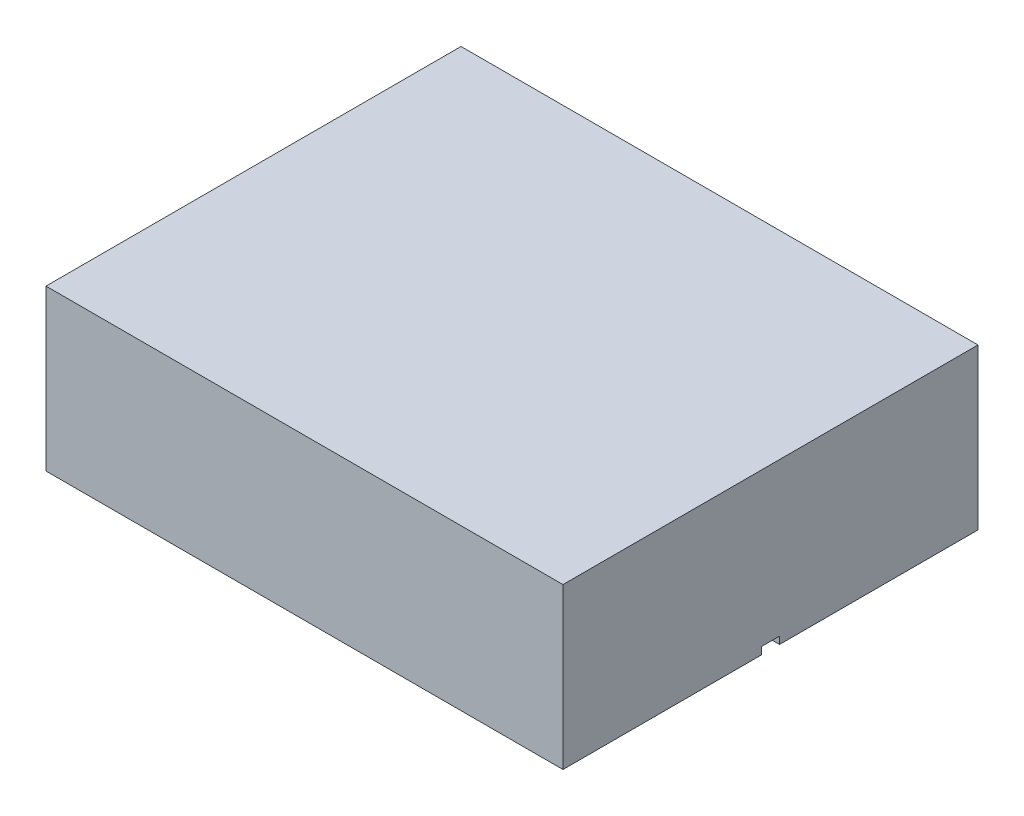
ISO-10303-21;
HEADER;
FILE_DESCRIPTION(('STEP AP214'),'2;1');
FILE_NAME('part.step','',(''),(''),'','','');
FILE_SCHEMA(('AUTOMOTIVE_DESIGN { 1 0 10303 214 1 1 1 1 }'));
ENDSEC;
DATA;
#1=APPLICATION_CONTEXT('core data for automotive mechanical design processes');
#2=APPLICATION_PROTOCOL_DEFINITION('international standard','automotive_design',2000,#1);
#3=PRODUCT_CONTEXT('',#1,'mechanical');
#4=PRODUCT('Part','Part','',(#3));
#5=PRODUCT_RELATED_PRODUCT_CATEGORY('part','',(#4));
#6=PRODUCT_DEFINITION_FORMATION('','',#4);
#7=PRODUCT_DEFINITION_CONTEXT('part definition',#1,'design');
#8=PRODUCT_DEFINITION('design','',#6,#7);
#9=PRODUCT_DEFINITION_SHAPE('','',#8);
#10=(LENGTH_UNIT() NAMED_UNIT(*) SI_UNIT(.MILLI.,.METRE.));
#11=(NAMED_UNIT(*) PLANE_ANGLE_UNIT() SI_UNIT($,.RADIAN.));
#12=(NAMED_UNIT(*) SI_UNIT($,.STERADIAN.) SOLID_ANGLE_UNIT());
#13=UNCERTAINTY_MEASURE_WITH_UNIT(LENGTH_MEASURE(1.E-05),#10,'distance_accuracy_value','');
#14=(GEOMETRIC_REPRESENTATION_CONTEXT(3) GLOBAL_UNCERTAINTY_ASSIGNED_CONTEXT((#13)) GLOBAL_UNIT_ASSIGNED_CONTEXT((#10,
#11,#12)) REPRESENTATION_CONTEXT('',''));
#15=CARTESIAN_POINT('',(0.,0.,0.));
#16=DIRECTION('',(0.,0.,1.));
#17=DIRECTION('',(1.,0.,0.));
#18=AXIS2_PLACEMENT_3D('',#15,#16,#17);
#19=CARTESIAN_POINT('',(0.,55.88,0.));
#20=DIRECTION('',(1.,0.,0.));
#21=DIRECTION('',(0.,0.,-1.));
#22=AXIS2_PLACEMENT_3D('',#19,#20,#21);
#23=PLANE('',#22);
#24=DIRECTION('',(0.,0.,-1.));
#25=VECTOR('',#24,1.);
#26=CARTESIAN_POINT('',(0.,2.54,0.));
#27=LINE('',#26,#25);
#28=CARTESIAN_POINT('',(0.,2.54,-69.215));
#29=VERTEX_POINT('',#28);
#30=CARTESIAN_POINT('',(0.,2.54,-75.565));
#31=VERTEX_POINT('',#30);
#32=EDGE_CURVE('E11',#29,#31,#27,.T.);
#33=ORIENTED_EDGE('',*,*,#32,.F.);
#34=DIRECTION('',(0.,-1.,0.));
#35=VECTOR('',#34,1.);
#36=CARTESIAN_POINT('',(0.,2.54,-69.215));
#37=LINE('',#36,#35);
#38=CARTESIAN_POINT('',(0.,0.,-69.215));
#39=VERTEX_POINT('',#38);
#40=EDGE_CURVE('E254',#29,#39,#37,.T.);
#41=ORIENTED_EDGE('',*,*,#40,.T.);
#42=DIRECTION('',(0.,0.,1.));
#43=VECTOR('',#42,1.);
#44=CARTESIAN_POINT('',(0.,0.,0.));
#45=LINE('',#44,#43);
#46=CARTESIAN_POINT('',(0.,0.,0.));
#47=VERTEX_POINT('',#46);
#48=EDGE_CURVE('E203',#39,#47,#45,.T.);
#49=ORIENTED_EDGE('',*,*,#48,.T.);
#50=DIRECTION('',(0.,-1.,0.));
#51=VECTOR('',#50,1.);
#52=CARTESIAN_POINT('',(0.,55.88,0.));
#53=LINE('',#52,#51);
#54=CARTESIAN_POINT('',(0.,55.88,0.));
#55=VERTEX_POINT('',#54);
#56=EDGE_CURVE('E217',#55,#47,#53,.T.);
#57=ORIENTED_EDGE('',*,*,#56,.F.);
#58=DIRECTION('',(0.,0.,1.));
#59=VECTOR('',#58,1.);
#60=CARTESIAN_POINT('',(0.,55.88,0.));
#61=LINE('',#60,#59);
#62=CARTESIAN_POINT('',(0.,55.88,-144.78));
#63=VERTEX_POINT('',#62);
#64=EDGE_CURVE('E190',#63,#55,#61,.T.);
#65=ORIENTED_EDGE('',*,*,#64,.F.);
#66=DIRECTION('',(0.,-1.,0.));
#67=VECTOR('',#66,1.);
#68=CARTESIAN_POINT('',(0.,55.88,-144.78));
#69=LINE('',#68,#67);
#70=CARTESIAN_POINT('',(0.,0.,-144.78));
#71=VERTEX_POINT('',#70);
#72=EDGE_CURVE('E200',#63,#71,#69,.T.);
#73=ORIENTED_EDGE('',*,*,#72,.T.);
#74=CARTESIAN_POINT('',(0.,0.,-75.565));
#75=VERTEX_POINT('',#74);
#76=EDGE_CURVE('E157',#71,#75,#45,.T.);
#77=ORIENTED_EDGE('',*,*,#76,.T.);
#78=DIRECTION('',(0.,-1.,0.));
#79=VECTOR('',#78,1.);
#80=CARTESIAN_POINT('',(0.,2.54,-75.565));
#81=LINE('',#80,#79);
#82=EDGE_CURVE('E71',#31,#75,#81,.T.);
#83=ORIENTED_EDGE('',*,*,#82,.F.);
#84=EDGE_LOOP('',(#33,#41,#49,#57,#65,#73,#77,#83));
#85=FACE_BOUND('',#84,.T.);
#86=ADVANCED_FACE('F49',(#85),#23,.F.);
#87=CARTESIAN_POINT('',(0.,55.88,0.));
#88=DIRECTION('',(0.,0.,-1.));
#89=DIRECTION('',(-1.,0.,0.));
#90=AXIS2_PLACEMENT_3D('',#87,#88,#89);
#91=PLANE('',#90);
#92=DIRECTION('',(1.,0.,0.));
#93=VECTOR('',#92,1.);
#94=CARTESIAN_POINT('',(0.,0.,0.));
#95=LINE('',#94,#93);
#96=CARTESIAN_POINT('',(180.34,0.,0.));
#97=VERTEX_POINT('',#96);
#98=EDGE_CURVE('E202',#47,#97,#95,.T.);
#99=ORIENTED_EDGE('',*,*,#98,.T.);
#100=DIRECTION('',(0.,-1.,0.));
#101=VECTOR('',#100,1.);
#102=CARTESIAN_POINT('',(180.34,55.88,0.));
#103=LINE('',#102,#101);
#104=CARTESIAN_POINT('',(180.34,55.88,0.));
#105=VERTEX_POINT('',#104);
#106=EDGE_CURVE('E214',#105,#97,#103,.T.);
#107=ORIENTED_EDGE('',*,*,#106,.F.);
#108=DIRECTION('',(1.,0.,0.));
#109=VECTOR('',#108,1.);
#110=CARTESIAN_POINT('',(0.,55.88,0.));
#111=LINE('',#110,#109);
#112=EDGE_CURVE('E193',#55,#105,#111,.T.);
#113=ORIENTED_EDGE('',*,*,#112,.F.);
#114=ORIENTED_EDGE('',*,*,#56,.T.);
#115=EDGE_LOOP('',(#99,#107,#113,#114));
#116=FACE_BOUND('',#115,.T.);
#117=ADVANCED_FACE('F253',(#116),#91,.F.);
#118=CARTESIAN_POINT('',(180.34,55.88,0.));
#119=DIRECTION('',(-1.,0.,0.));
#120=DIRECTION('',(0.,0.,1.));
#121=AXIS2_PLACEMENT_3D('',#118,#119,#120);
#122=PLANE('',#121);
#123=DIRECTION('',(0.,0.,-1.));
#124=VECTOR('',#123,1.);
#125=CARTESIAN_POINT('',(180.34,2.54,0.));
#126=LINE('',#125,#124);
#127=CARTESIAN_POINT('',(180.34,2.54,-69.215));
#128=VERTEX_POINT('',#127);
#129=CARTESIAN_POINT('',(180.34,2.54,-75.565));
#130=VERTEX_POINT('',#129);
#131=EDGE_CURVE('E56',#128,#130,#126,.T.);
#132=ORIENTED_EDGE('',*,*,#131,.T.);
#133=DIRECTION('',(0.,-1.,0.));
#134=VECTOR('',#133,1.);
#135=CARTESIAN_POINT('',(180.34,2.54,-75.565));
#136=LINE('',#135,#134);
#137=CARTESIAN_POINT('',(180.34,0.,-75.565));
#138=VERTEX_POINT('',#137);
#139=EDGE_CURVE('E170',#130,#138,#136,.T.);
#140=ORIENTED_EDGE('',*,*,#139,.T.);
#141=DIRECTION('',(0.,0.,-1.));
#142=VECTOR('',#141,1.);
#143=CARTESIAN_POINT('',(180.34,0.,0.));
#144=LINE('',#143,#142);
#145=CARTESIAN_POINT('',(180.34,0.,-144.78));
#146=VERTEX_POINT('',#145);
#147=EDGE_CURVE('E205',#138,#146,#144,.T.);
#148=ORIENTED_EDGE('',*,*,#147,.T.);
#149=DIRECTION('',(0.,-1.,0.));
#150=VECTOR('',#149,1.);
#151=CARTESIAN_POINT('',(180.34,55.88,-144.78));
#152=LINE('',#151,#150);
#153=CARTESIAN_POINT('',(180.34,55.88,-144.78));
#154=VERTEX_POINT('',#153);
#155=EDGE_CURVE('E211',#154,#146,#152,.T.);
#156=ORIENTED_EDGE('',*,*,#155,.F.);
#157=DIRECTION('',(0.,0.,-1.));
#158=VECTOR('',#157,1.);
#159=CARTESIAN_POINT('',(180.34,55.88,0.));
#160=LINE('',#159,#158);
#161=EDGE_CURVE('E196',#105,#154,#160,.T.);
#162=ORIENTED_EDGE('',*,*,#161,.F.);
#163=ORIENTED_EDGE('',*,*,#106,.T.);
#164=CARTESIAN_POINT('',(180.34,0.,-69.215));
#165=VERTEX_POINT('',#164);
#166=EDGE_CURVE('E206',#97,#165,#144,.T.);
#167=ORIENTED_EDGE('',*,*,#166,.T.);
#168=DIRECTION('',(0.,-1.,0.));
#169=VECTOR('',#168,1.);
#170=CARTESIAN_POINT('',(180.34,2.54,-69.215));
#171=LINE('',#170,#169);
#172=EDGE_CURVE('E63',#128,#165,#171,.T.);
#173=ORIENTED_EDGE('',*,*,#172,.F.);
#174=EDGE_LOOP('',(#132,#140,#148,#156,#162,#163,#167,#173));
#175=FACE_BOUND('',#174,.T.);
#176=ADVANCED_FACE('F221',(#175),#122,.F.);
#177=CARTESIAN_POINT('',(0.,55.88,-144.78));
#178=DIRECTION('',(0.,0.,1.));
#179=DIRECTION('',(1.,0.,0.));
#180=AXIS2_PLACEMENT_3D('',#177,#178,#179);
#181=PLANE('',#180);
#182=DIRECTION('',(-1.,0.,0.));
#183=VECTOR('',#182,1.);
#184=CARTESIAN_POINT('',(0.,0.,-144.78));
#185=LINE('',#184,#183);
#186=EDGE_CURVE('E194',#146,#71,#185,.T.);
#187=ORIENTED_EDGE('',*,*,#186,.T.);
#188=ORIENTED_EDGE('',*,*,#72,.F.);
#189=DIRECTION('',(-1.,0.,0.));
#190=VECTOR('',#189,1.);
#191=CARTESIAN_POINT('',(0.,55.88,-144.78));
#192=LINE('',#191,#190);
#193=EDGE_CURVE('E198',#154,#63,#192,.T.);
#194=ORIENTED_EDGE('',*,*,#193,.F.);
#195=ORIENTED_EDGE('',*,*,#155,.T.);
#196=EDGE_LOOP('',(#187,#188,#194,#195));
#197=FACE_BOUND('',#196,.T.);
#198=ADVANCED_FACE('F242',(#197),#181,.F.);
#199=CARTESIAN_POINT('',(0.,55.88,0.));
#200=DIRECTION('',(0.,-1.,0.));
#201=DIRECTION('',(0.,0.,-1.));
#202=AXIS2_PLACEMENT_3D('',#199,#200,#201);
#203=PLANE('',#202);
#204=ORIENTED_EDGE('',*,*,#64,.T.);
#205=ORIENTED_EDGE('',*,*,#112,.T.);
#206=ORIENTED_EDGE('',*,*,#161,.T.);
#207=ORIENTED_EDGE('',*,*,#193,.T.);
#208=EDGE_LOOP('',(#204,#205,#206,#207));
#209=FACE_BOUND('',#208,.T.);
#210=ADVANCED_FACE('F246',(#209),#203,.F.);
#211=CARTESIAN_POINT('',(0.,0.,0.));
#212=DIRECTION('',(0.,-1.,0.));
#213=DIRECTION('',(0.,0.,-1.));
#214=AXIS2_PLACEMENT_3D('',#211,#212,#213);
#215=PLANE('',#214);
#216=CARTESIAN_POINT('',(13.3825016648169,0.,-72.39));
#217=DIRECTION('',(0.,-1.,0.));
#218=DIRECTION('',(0.,0.,-1.));
#219=AXIS2_PLACEMENT_3D('',#216,#217,#218);
#220=CIRCLE('',#219,2.54);
#221=CARTESIAN_POINT('',(13.3825016648169,0.,-74.93));
#222=VERTEX_POINT('',#221);
#223=EDGE_CURVE('E269',#222,#222,#220,.T.);
#224=ORIENTED_EDGE('',*,*,#223,.F.);
#225=EDGE_LOOP('',(#224));
#226=FACE_BOUND('',#225,.T.);
#227=CARTESIAN_POINT('',(166.957498335183,0.,-72.39));
#228=DIRECTION('',(0.,-1.,0.));
#229=DIRECTION('',(0.,0.,-1.));
#230=AXIS2_PLACEMENT_3D('',#227,#228,#229);
#231=CIRCLE('',#230,2.53999999999998);
#232=CARTESIAN_POINT('',(166.957498335183,0.,-74.93));
#233=VERTEX_POINT('',#232);
#234=EDGE_CURVE('E266',#233,#233,#231,.T.);
#235=ORIENTED_EDGE('',*,*,#234,.F.);
#236=EDGE_LOOP('',(#235));
#237=FACE_BOUND('',#236,.T.);
#238=DIRECTION('',(-1.,0.,0.));
#239=VECTOR('',#238,1.);
#240=CARTESIAN_POINT('',(0.,0.,-69.215));
#241=LINE('',#240,#239);
#242=CARTESIAN_POINT('',(2.53999999999997,0.,-69.215));
#243=VERTEX_POINT('',#242);
#244=EDGE_CURVE('E152',#243,#39,#241,.T.);
#245=ORIENTED_EDGE('',*,*,#244,.F.);
#246=CARTESIAN_POINT('',(2.53999999999997,0.,-72.39));
#247=DIRECTION('',(0.,-1.,0.));
#248=DIRECTION('',(0.,0.,-1.));
#249=AXIS2_PLACEMENT_3D('',#246,#247,#248);
#250=CIRCLE('',#249,3.17500000000001);
#251=CARTESIAN_POINT('',(2.53999999999999,0.,-75.565));
#252=VERTEX_POINT('',#251);
#253=EDGE_CURVE('E258',#252,#243,#250,.T.);
#254=ORIENTED_EDGE('',*,*,#253,.F.);
#255=DIRECTION('',(1.,0.,0.));
#256=VECTOR('',#255,1.);
#257=CARTESIAN_POINT('',(0.,0.,-75.565));
#258=LINE('',#257,#256);
#259=EDGE_CURVE('E182',#75,#252,#258,.T.);
#260=ORIENTED_EDGE('',*,*,#259,.F.);
#261=ORIENTED_EDGE('',*,*,#76,.F.);
#262=ORIENTED_EDGE('',*,*,#186,.F.);
#263=ORIENTED_EDGE('',*,*,#147,.F.);
#264=DIRECTION('',(1.,0.,0.));
#265=VECTOR('',#264,1.);
#266=CARTESIAN_POINT('',(180.34,0.,-75.565));
#267=LINE('',#266,#265);
#268=CARTESIAN_POINT('',(177.8,0.,-75.565));
#269=VERTEX_POINT('',#268);
#270=EDGE_CURVE('E174',#269,#138,#267,.T.);
#271=ORIENTED_EDGE('',*,*,#270,.F.);
#272=CARTESIAN_POINT('',(177.8,0.,-72.39));
#273=DIRECTION('',(0.,-1.,0.));
#274=DIRECTION('',(0.,0.,1.));
#275=AXIS2_PLACEMENT_3D('',#272,#273,#274);
#276=CIRCLE('',#275,3.17500000000001);
#277=CARTESIAN_POINT('',(177.8,0.,-69.215));
#278=VERTEX_POINT('',#277);
#279=EDGE_CURVE('E176',#278,#269,#276,.T.);
#280=ORIENTED_EDGE('',*,*,#279,.F.);
#281=DIRECTION('',(-1.,0.,0.));
#282=VECTOR('',#281,1.);
#283=CARTESIAN_POINT('',(180.34,0.,-69.215));
#284=LINE('',#283,#282);
#285=EDGE_CURVE('E180',#165,#278,#284,.T.);
#286=ORIENTED_EDGE('',*,*,#285,.F.);
#287=ORIENTED_EDGE('',*,*,#166,.F.);
#288=ORIENTED_EDGE('',*,*,#98,.F.);
#289=ORIENTED_EDGE('',*,*,#48,.F.);
#290=EDGE_LOOP('',(#245,#254,#260,#261,#262,#263,#271,#280,#286,#287,#288,#289));
#291=FACE_BOUND('',#290,.T.);
#292=ADVANCED_FACE('F236',(#226,#237,#291),#215,.T.);
#293=CARTESIAN_POINT('',(180.34,2.54,-72.39));
#294=DIRECTION('',(0.,1.,0.));
#295=DIRECTION('',(0.,0.,1.));
#296=AXIS2_PLACEMENT_3D('',#293,#294,#295);
#297=PLANE('',#296);
#298=DIRECTION('',(-1.,0.,0.));
#299=VECTOR('',#298,1.);
#300=CARTESIAN_POINT('',(180.34,2.54,-69.215));
#301=LINE('',#300,#299);
#302=CARTESIAN_POINT('',(177.8,2.54,-69.215));
#303=VERTEX_POINT('',#302);
#304=EDGE_CURVE('E177',#128,#303,#301,.T.);
#305=ORIENTED_EDGE('',*,*,#304,.T.);
#306=CARTESIAN_POINT('',(177.8,2.54,-72.39));
#307=DIRECTION('',(0.,-1.,0.));
#308=DIRECTION('',(0.,0.,1.));
#309=AXIS2_PLACEMENT_3D('',#306,#307,#308);
#310=CIRCLE('',#309,3.17500000000001);
#311=CARTESIAN_POINT('',(177.8,2.54,-75.565));
#312=VERTEX_POINT('',#311);
#313=EDGE_CURVE('E185',#303,#312,#310,.T.);
#314=ORIENTED_EDGE('',*,*,#313,.T.);
#315=DIRECTION('',(1.,0.,0.));
#316=VECTOR('',#315,1.);
#317=CARTESIAN_POINT('',(180.34,2.54,-75.565));
#318=LINE('',#317,#316);
#319=EDGE_CURVE('E165',#312,#130,#318,.T.);
#320=ORIENTED_EDGE('',*,*,#319,.T.);
#321=ORIENTED_EDGE('',*,*,#131,.F.);
#322=EDGE_LOOP('',(#305,#314,#320,#321));
#323=FACE_BOUND('',#322,.T.);
#324=ADVANCED_FACE('F224',(#323),#297,.F.);
#325=CARTESIAN_POINT('',(180.34,2.54,-75.565));
#326=DIRECTION('',(0.,0.,-1.));
#327=DIRECTION('',(-1.,0.,0.));
#328=AXIS2_PLACEMENT_3D('',#325,#326,#327);
#329=PLANE('',#328);
#330=ORIENTED_EDGE('',*,*,#270,.T.);
#331=ORIENTED_EDGE('',*,*,#139,.F.);
#332=ORIENTED_EDGE('',*,*,#319,.F.);
#333=DIRECTION('',(0.,-1.,0.));
#334=VECTOR('',#333,1.);
#335=CARTESIAN_POINT('',(177.8,2.54,-75.565));
#336=LINE('',#335,#334);
#337=EDGE_CURVE('E168',#312,#269,#336,.T.);
#338=ORIENTED_EDGE('',*,*,#337,.T.);
#339=EDGE_LOOP('',(#330,#331,#332,#338));
#340=FACE_BOUND('',#339,.T.);
#341=ADVANCED_FACE('F232',(#340),#329,.F.);
#342=CARTESIAN_POINT('',(177.8,2.54,-72.39));
#343=DIRECTION('',(0.,-1.,0.));
#344=DIRECTION('',(0.,0.,-1.));
#345=AXIS2_PLACEMENT_3D('',#342,#343,#344);
#346=CYLINDRICAL_SURFACE('',#345,3.17500000000001);
#347=ORIENTED_EDGE('',*,*,#279,.T.);
#348=ORIENTED_EDGE('',*,*,#337,.F.);
#349=ORIENTED_EDGE('',*,*,#313,.F.);
#350=DIRECTION('',(0.,-1.,0.));
#351=VECTOR('',#350,1.);
#352=CARTESIAN_POINT('',(177.8,2.54,-69.215));
#353=LINE('',#352,#351);
#354=EDGE_CURVE('E166',#303,#278,#353,.T.);
#355=ORIENTED_EDGE('',*,*,#354,.T.);
#356=EDGE_LOOP('',(#347,#348,#349,#355));
#357=FACE_BOUND('',#356,.T.);
#358=ADVANCED_FACE('F230',(#357),#346,.F.);
#359=CARTESIAN_POINT('',(180.34,2.54,-69.215));
#360=DIRECTION('',(0.,0.,1.));
#361=DIRECTION('',(1.,0.,0.));
#362=AXIS2_PLACEMENT_3D('',#359,#360,#361);
#363=PLANE('',#362);
#364=ORIENTED_EDGE('',*,*,#285,.T.);
#365=ORIENTED_EDGE('',*,*,#354,.F.);
#366=ORIENTED_EDGE('',*,*,#304,.F.);
#367=ORIENTED_EDGE('',*,*,#172,.T.);
#368=EDGE_LOOP('',(#364,#365,#366,#367));
#369=FACE_BOUND('',#368,.T.);
#370=ADVANCED_FACE('F226',(#369),#363,.F.);
#371=CARTESIAN_POINT('',(0.,2.54,-72.39));
#372=DIRECTION('',(0.,-1.,0.));
#373=DIRECTION('',(0.,0.,-1.));
#374=AXIS2_PLACEMENT_3D('',#371,#372,#373);
#375=PLANE('',#374);
#376=ORIENTED_EDGE('',*,*,#32,.T.);
#377=DIRECTION('',(1.,0.,0.));
#378=VECTOR('',#377,1.);
#379=CARTESIAN_POINT('',(0.,2.54,-75.565));
#380=LINE('',#379,#378);
#381=CARTESIAN_POINT('',(2.53999999999999,2.54,-75.565));
#382=VERTEX_POINT('',#381);
#383=EDGE_CURVE('E143',#31,#382,#380,.T.);
#384=ORIENTED_EDGE('',*,*,#383,.T.);
#385=CARTESIAN_POINT('',(2.53999999999997,2.54,-72.39));
#386=DIRECTION('',(0.,-1.,0.));
#387=DIRECTION('',(0.,0.,-1.));
#388=AXIS2_PLACEMENT_3D('',#385,#386,#387);
#389=CIRCLE('',#388,3.17500000000001);
#390=CARTESIAN_POINT('',(2.53999999999997,2.54,-69.215));
#391=VERTEX_POINT('',#390);
#392=EDGE_CURVE('E151',#382,#391,#389,.T.);
#393=ORIENTED_EDGE('',*,*,#392,.T.);
#394=DIRECTION('',(-1.,0.,0.));
#395=VECTOR('',#394,1.);
#396=CARTESIAN_POINT('',(0.,2.54,-69.215));
#397=LINE('',#396,#395);
#398=EDGE_CURVE('E145',#391,#29,#397,.T.);
#399=ORIENTED_EDGE('',*,*,#398,.T.);
#400=EDGE_LOOP('',(#376,#384,#393,#399));
#401=FACE_BOUND('',#400,.T.);
#402=ADVANCED_FACE('F141',(#401),#375,.T.);
#403=CARTESIAN_POINT('',(0.,2.54,-69.215));
#404=DIRECTION('',(0.,0.,1.));
#405=DIRECTION('',(1.,0.,0.));
#406=AXIS2_PLACEMENT_3D('',#403,#404,#405);
#407=PLANE('',#406);
#408=ORIENTED_EDGE('',*,*,#244,.T.);
#409=ORIENTED_EDGE('',*,*,#40,.F.);
#410=ORIENTED_EDGE('',*,*,#398,.F.);
#411=DIRECTION('',(0.,-1.,0.));
#412=VECTOR('',#411,1.);
#413=CARTESIAN_POINT('',(2.53999999999997,2.54,-69.215));
#414=LINE('',#413,#412);
#415=EDGE_CURVE('E159',#391,#243,#414,.T.);
#416=ORIENTED_EDGE('',*,*,#415,.T.);
#417=EDGE_LOOP('',(#408,#409,#410,#416));
#418=FACE_BOUND('',#417,.T.);
#419=ADVANCED_FACE('F325',(#418),#407,.F.);
#420=CARTESIAN_POINT('',(2.53999999999997,2.54,-72.39));
#421=DIRECTION('',(0.,-1.,0.));
#422=DIRECTION('',(0.,0.,-1.));
#423=AXIS2_PLACEMENT_3D('',#420,#421,#422);
#424=CYLINDRICAL_SURFACE('',#423,3.17500000000001);
#425=ORIENTED_EDGE('',*,*,#253,.T.);
#426=ORIENTED_EDGE('',*,*,#415,.F.);
#427=ORIENTED_EDGE('',*,*,#392,.F.);
#428=DIRECTION('',(0.,-1.,0.));
#429=VECTOR('',#428,1.);
#430=CARTESIAN_POINT('',(2.53999999999999,2.54,-75.565));
#431=LINE('',#430,#429);
#432=EDGE_CURVE('E149',#382,#252,#431,.T.);
#433=ORIENTED_EDGE('',*,*,#432,.T.);
#434=EDGE_LOOP('',(#425,#426,#427,#433));
#435=FACE_BOUND('',#434,.T.);
#436=ADVANCED_FACE('F299',(#435),#424,.F.);
#437=CARTESIAN_POINT('',(0.,2.54,-75.565));
#438=DIRECTION('',(0.,0.,-1.));
#439=DIRECTION('',(-1.,0.,0.));
#440=AXIS2_PLACEMENT_3D('',#437,#438,#439);
#441=PLANE('',#440);
#442=ORIENTED_EDGE('',*,*,#259,.T.);
#443=ORIENTED_EDGE('',*,*,#432,.F.);
#444=ORIENTED_EDGE('',*,*,#383,.F.);
#445=ORIENTED_EDGE('',*,*,#82,.T.);
#446=EDGE_LOOP('',(#442,#443,#444,#445));
#447=FACE_BOUND('',#446,.T.);
#448=ADVANCED_FACE('F148',(#447),#441,.F.);
#449=CARTESIAN_POINT('',(166.957498335183,2.54,-72.39));
#450=DIRECTION('',(0.,-1.,0.));
#451=DIRECTION('',(0.,0.,-1.));
#452=AXIS2_PLACEMENT_3D('',#449,#450,#451);
#453=CYLINDRICAL_SURFACE('',#452,2.53999999999998);
#454=CARTESIAN_POINT('',(166.957498335183,2.54,-72.39));
#455=DIRECTION('',(0.,-1.,0.));
#456=DIRECTION('',(0.,0.,-1.));
#457=AXIS2_PLACEMENT_3D('',#454,#455,#456);
#458=CIRCLE('',#457,2.53999999999998);
#459=CARTESIAN_POINT('',(166.957498335183,2.54,-74.93));
#460=VERTEX_POINT('',#459);
#461=EDGE_CURVE('E263',#460,#460,#458,.T.);
#462=ORIENTED_EDGE('',*,*,#461,.F.);
#463=EDGE_LOOP('',(#462));
#464=FACE_BOUND('',#463,.T.);
#465=ORIENTED_EDGE('',*,*,#234,.T.);
#466=EDGE_LOOP('',(#465));
#467=FACE_BOUND('',#466,.T.);
#468=ADVANCED_FACE('F289',(#464,#467),#453,.F.);
#469=CARTESIAN_POINT('',(166.957498335183,2.54,-72.39));
#470=DIRECTION('',(0.,-1.,0.));
#471=DIRECTION('',(0.,0.,-1.));
#472=AXIS2_PLACEMENT_3D('',#469,#470,#471);
#473=PLANE('',#472);
#474=ORIENTED_EDGE('',*,*,#461,.T.);
#475=EDGE_LOOP('',(#474));
#476=FACE_BOUND('',#475,.T.);
#477=ADVANCED_FACE('F280',(#476),#473,.T.);
#478=CARTESIAN_POINT('',(13.3825016648169,2.54,-72.39));
#479=DIRECTION('',(0.,-1.,0.));
#480=DIRECTION('',(0.,0.,-1.));
#481=AXIS2_PLACEMENT_3D('',#478,#479,#480);
#482=CYLINDRICAL_SURFACE('',#481,2.54);
#483=CARTESIAN_POINT('',(13.3825016648169,2.54,-72.39));
#484=DIRECTION('',(0.,-1.,0.));
#485=DIRECTION('',(0.,0.,-1.));
#486=AXIS2_PLACEMENT_3D('',#483,#484,#485);
#487=CIRCLE('',#486,2.54);
#488=CARTESIAN_POINT('',(13.3825016648169,2.54,-74.93));
#489=VERTEX_POINT('',#488);
#490=EDGE_CURVE('E173',#489,#489,#487,.T.);
#491=ORIENTED_EDGE('',*,*,#490,.F.);
#492=EDGE_LOOP('',(#491));
#493=FACE_BOUND('',#492,.T.);
#494=ORIENTED_EDGE('',*,*,#223,.T.);
#495=EDGE_LOOP('',(#494));
#496=FACE_BOUND('',#495,.T.);
#497=ADVANCED_FACE('F277',(#493,#496),#482,.F.);
#498=CARTESIAN_POINT('',(13.3825016648169,2.54,-72.39));
#499=DIRECTION('',(0.,-1.,0.));
#500=DIRECTION('',(0.,0.,-1.));
#501=AXIS2_PLACEMENT_3D('',#498,#499,#500);
#502=PLANE('',#501);
#503=ORIENTED_EDGE('',*,*,#490,.T.);
#504=EDGE_LOOP('',(#503));
#505=FACE_BOUND('',#504,.T.);
#506=ADVANCED_FACE('F275',(#505),#502,.T.);
#507=CLOSED_SHELL('',(#86,#117,#176,#198,#210,#292,#324,#341,#358,#370,#402,#419,#436,#448,#468,
#477,#497,#506));
#508=MANIFOLD_SOLID_BREP('B2',#507);
#509=ADVANCED_BREP_SHAPE_REPRESENTATION('',(#18,#508),#14);
#510=SHAPE_DEFINITION_REPRESENTATION(#9,#509);
ENDSEC;
END-ISO-10303-21;
